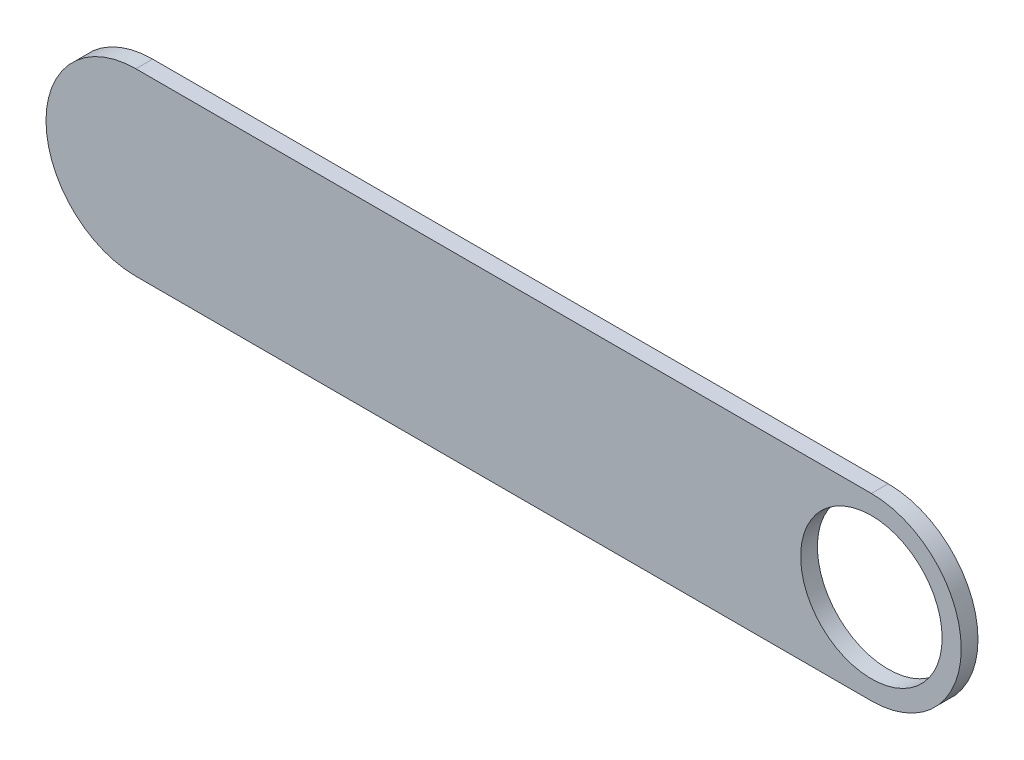
ISO-10303-21;
HEADER;
FILE_DESCRIPTION(('STEP AP214'),'2;1');
FILE_NAME('part.step','',(''),(''),'','','');
FILE_SCHEMA(('AUTOMOTIVE_DESIGN { 1 0 10303 214 1 1 1 1 }'));
ENDSEC;
DATA;
#1=APPLICATION_CONTEXT('core data for automotive mechanical design processes');
#2=APPLICATION_PROTOCOL_DEFINITION('international standard','automotive_design',2000,#1);
#3=PRODUCT_CONTEXT('',#1,'mechanical');
#4=PRODUCT('Part','Part','',(#3));
#5=PRODUCT_RELATED_PRODUCT_CATEGORY('part','',(#4));
#6=PRODUCT_DEFINITION_FORMATION('','',#4);
#7=PRODUCT_DEFINITION_CONTEXT('part definition',#1,'design');
#8=PRODUCT_DEFINITION('design','',#6,#7);
#9=PRODUCT_DEFINITION_SHAPE('','',#8);
#10=(LENGTH_UNIT() NAMED_UNIT(*) SI_UNIT(.MILLI.,.METRE.));
#11=(NAMED_UNIT(*) PLANE_ANGLE_UNIT() SI_UNIT($,.RADIAN.));
#12=(NAMED_UNIT(*) SI_UNIT($,.STERADIAN.) SOLID_ANGLE_UNIT());
#13=UNCERTAINTY_MEASURE_WITH_UNIT(LENGTH_MEASURE(1.E-05),#10,'distance_accuracy_value','');
#14=(GEOMETRIC_REPRESENTATION_CONTEXT(3) GLOBAL_UNCERTAINTY_ASSIGNED_CONTEXT((#13)) GLOBAL_UNIT_ASSIGNED_CONTEXT((#10,
#11,#12)) REPRESENTATION_CONTEXT('',''));
#15=CARTESIAN_POINT('',(0.,0.,0.));
#16=DIRECTION('',(0.,0.,1.));
#17=DIRECTION('',(1.,0.,0.));
#18=AXIS2_PLACEMENT_3D('',#15,#16,#17);
#19=CARTESIAN_POINT('',(19.64950096,12.2555,0.));
#20=DIRECTION('',(0.,1.,0.));
#21=DIRECTION('',(1.,0.,0.));
#22=AXIS2_PLACEMENT_3D('',#19,#20,#21);
#23=PLANE('',#22);
#24=DIRECTION('',(1.,0.,0.));
#25=VECTOR('',#24,1.);
#26=CARTESIAN_POINT('',(19.64950096,12.2555,0.03556));
#27=LINE('',#26,#25);
#28=CARTESIAN_POINT('',(19.64950096,12.2555,0.03556));
#29=VERTEX_POINT('',#28);
#30=CARTESIAN_POINT('',(21.209,12.2555,0.03556));
#31=VERTEX_POINT('',#30);
#32=EDGE_CURVE('E11',#29,#31,#27,.T.);
#33=ORIENTED_EDGE('',*,*,#32,.F.);
#34=DIRECTION('',(0.,0.,1.));
#35=VECTOR('',#34,1.);
#36=CARTESIAN_POINT('',(19.64950096,12.2555,0.));
#37=LINE('',#36,#35);
#38=CARTESIAN_POINT('',(19.64950096,12.2555,0.));
#39=VERTEX_POINT('',#38);
#40=EDGE_CURVE('E23',#39,#29,#37,.T.);
#41=ORIENTED_EDGE('',*,*,#40,.F.);
#42=DIRECTION('',(1.,0.,0.));
#43=VECTOR('',#42,1.);
#44=CARTESIAN_POINT('',(19.64950096,12.2555,0.));
#45=LINE('',#44,#43);
#46=CARTESIAN_POINT('',(21.209,12.2555,0.));
#47=VERTEX_POINT('',#46);
#48=EDGE_CURVE('E95',#39,#47,#45,.T.);
#49=ORIENTED_EDGE('',*,*,#48,.T.);
#50=DIRECTION('',(0.,0.,1.));
#51=VECTOR('',#50,1.);
#52=CARTESIAN_POINT('',(21.209,12.2555,0.));
#53=LINE('',#52,#51);
#54=EDGE_CURVE('E36',#47,#31,#53,.T.);
#55=ORIENTED_EDGE('',*,*,#54,.T.);
#56=EDGE_LOOP('',(#33,#41,#49,#55));
#57=FACE_BOUND('',#56,.T.);
#58=ADVANCED_FACE('F16',(#57),#23,.F.);
#59=CARTESIAN_POINT('',(19.64950096,12.446,0.));
#60=DIRECTION('',(0.,0.,-1.));
#61=DIRECTION('',(0.,1.,0.));
#62=AXIS2_PLACEMENT_3D('',#59,#60,#61);
#63=CYLINDRICAL_SURFACE('',#62,0.1905);
#64=CARTESIAN_POINT('',(19.64950096,12.446,0.03556));
#65=DIRECTION('',(0.,0.,1.));
#66=DIRECTION('',(0.,1.,0.));
#67=AXIS2_PLACEMENT_3D('',#64,#65,#66);
#68=CIRCLE('',#67,0.1905);
#69=CARTESIAN_POINT('',(19.64950096,12.6365,0.03556));
#70=VERTEX_POINT('',#69);
#71=EDGE_CURVE('E91',#70,#29,#68,.T.);
#72=ORIENTED_EDGE('',*,*,#71,.F.);
#73=DIRECTION('',(0.,0.,1.));
#74=VECTOR('',#73,1.);
#75=CARTESIAN_POINT('',(19.64950096,12.6365,0.));
#76=LINE('',#75,#74);
#77=CARTESIAN_POINT('',(19.64950096,12.6365,0.));
#78=VERTEX_POINT('',#77);
#79=EDGE_CURVE('E89',#78,#70,#76,.T.);
#80=ORIENTED_EDGE('',*,*,#79,.F.);
#81=CARTESIAN_POINT('',(19.64950096,12.446,0.));
#82=DIRECTION('',(0.,0.,1.));
#83=DIRECTION('',(0.,1.,0.));
#84=AXIS2_PLACEMENT_3D('',#81,#82,#83);
#85=CIRCLE('',#84,0.1905);
#86=EDGE_CURVE('E87',#78,#39,#85,.T.);
#87=ORIENTED_EDGE('',*,*,#86,.T.);
#88=ORIENTED_EDGE('',*,*,#40,.T.);
#89=EDGE_LOOP('',(#72,#80,#87,#88));
#90=FACE_BOUND('',#89,.T.);
#91=ADVANCED_FACE('F110',(#90),#63,.T.);
#92=CARTESIAN_POINT('',(21.209,12.446,0.));
#93=DIRECTION('',(0.,0.,-1.));
#94=DIRECTION('',(0.,-1.,0.));
#95=AXIS2_PLACEMENT_3D('',#92,#93,#94);
#96=CYLINDRICAL_SURFACE('',#95,0.1905);
#97=CARTESIAN_POINT('',(21.209,12.446,0.03556));
#98=DIRECTION('',(0.,0.,1.));
#99=DIRECTION('',(0.,-1.,0.));
#100=AXIS2_PLACEMENT_3D('',#97,#98,#99);
#101=CIRCLE('',#100,0.1905);
#102=CARTESIAN_POINT('',(21.209,12.6365,0.03556));
#103=VERTEX_POINT('',#102);
#104=EDGE_CURVE('E84',#31,#103,#101,.T.);
#105=ORIENTED_EDGE('',*,*,#104,.F.);
#106=ORIENTED_EDGE('',*,*,#54,.F.);
#107=CARTESIAN_POINT('',(21.209,12.446,0.));
#108=DIRECTION('',(0.,0.,1.));
#109=DIRECTION('',(0.,-1.,0.));
#110=AXIS2_PLACEMENT_3D('',#107,#108,#109);
#111=CIRCLE('',#110,0.1905);
#112=CARTESIAN_POINT('',(21.209,12.6365,0.));
#113=VERTEX_POINT('',#112);
#114=EDGE_CURVE('E81',#47,#113,#111,.T.);
#115=ORIENTED_EDGE('',*,*,#114,.T.);
#116=DIRECTION('',(0.,0.,1.));
#117=VECTOR('',#116,1.);
#118=CARTESIAN_POINT('',(21.209,12.6365,0.));
#119=LINE('',#118,#117);
#120=EDGE_CURVE('E79',#113,#103,#119,.T.);
#121=ORIENTED_EDGE('',*,*,#120,.T.);
#122=EDGE_LOOP('',(#105,#106,#115,#121));
#123=FACE_BOUND('',#122,.T.);
#124=ADVANCED_FACE('F103',(#123),#96,.T.);
#125=CARTESIAN_POINT('',(21.209,12.6365,0.));
#126=DIRECTION('',(0.,-1.,0.));
#127=DIRECTION('',(-1.,0.,0.));
#128=AXIS2_PLACEMENT_3D('',#125,#126,#127);
#129=PLANE('',#128);
#130=DIRECTION('',(-1.,0.,0.));
#131=VECTOR('',#130,1.);
#132=CARTESIAN_POINT('',(21.209,12.6365,0.03556));
#133=LINE('',#132,#131);
#134=EDGE_CURVE('E76',#103,#70,#133,.T.);
#135=ORIENTED_EDGE('',*,*,#134,.F.);
#136=ORIENTED_EDGE('',*,*,#120,.F.);
#137=DIRECTION('',(-1.,0.,0.));
#138=VECTOR('',#137,1.);
#139=CARTESIAN_POINT('',(21.209,12.6365,0.));
#140=LINE('',#139,#138);
#141=EDGE_CURVE('E67',#113,#78,#140,.T.);
#142=ORIENTED_EDGE('',*,*,#141,.T.);
#143=ORIENTED_EDGE('',*,*,#79,.T.);
#144=EDGE_LOOP('',(#135,#136,#142,#143));
#145=FACE_BOUND('',#144,.T.);
#146=ADVANCED_FACE('F109',(#145),#129,.F.);
#147=CARTESIAN_POINT('',(21.209,12.446,0.));
#148=DIRECTION('',(0.,0.,-1.));
#149=DIRECTION('',(1.,0.,0.));
#150=AXIS2_PLACEMENT_3D('',#147,#148,#149);
#151=CYLINDRICAL_SURFACE('',#150,0.1499997);
#152=DIRECTION('',(0.,0.,1.));
#153=VECTOR('',#152,1.);
#154=CARTESIAN_POINT('',(21.3589997,12.446,0.));
#155=LINE('',#154,#153);
#156=CARTESIAN_POINT('',(21.3589997,12.446,0.));
#157=VERTEX_POINT('',#156);
#158=CARTESIAN_POINT('',(21.3589997,12.446,0.03556));
#159=VERTEX_POINT('',#158);
#160=EDGE_CURVE('E61',#157,#159,#155,.T.);
#161=ORIENTED_EDGE('',*,*,#160,.T.);
#162=CARTESIAN_POINT('',(21.209,12.446,0.03556));
#163=DIRECTION('',(0.,0.,1.));
#164=DIRECTION('',(1.,0.,0.));
#165=AXIS2_PLACEMENT_3D('',#162,#163,#164);
#166=CIRCLE('',#165,0.1499997);
#167=EDGE_CURVE('E66',#159,#159,#166,.T.);
#168=ORIENTED_EDGE('',*,*,#167,.T.);
#169=ORIENTED_EDGE('',*,*,#160,.F.);
#170=CARTESIAN_POINT('',(21.209,12.446,0.));
#171=DIRECTION('',(0.,0.,1.));
#172=DIRECTION('',(1.,0.,0.));
#173=AXIS2_PLACEMENT_3D('',#170,#171,#172);
#174=CIRCLE('',#173,0.1499997);
#175=EDGE_CURVE('E64',#157,#157,#174,.T.);
#176=ORIENTED_EDGE('',*,*,#175,.F.);
#177=EDGE_LOOP('',(#161,#168,#169,#176));
#178=FACE_BOUND('',#177,.T.);
#179=ADVANCED_FACE('F63',(#178),#151,.F.);
#180=CARTESIAN_POINT('',(20.42925048,12.446,0.));
#181=DIRECTION('',(0.,0.,1.));
#182=DIRECTION('',(1.,0.,0.));
#183=AXIS2_PLACEMENT_3D('',#180,#181,#182);
#184=PLANE('',#183);
#185=ORIENTED_EDGE('',*,*,#141,.F.);
#186=ORIENTED_EDGE('',*,*,#114,.F.);
#187=ORIENTED_EDGE('',*,*,#48,.F.);
#188=ORIENTED_EDGE('',*,*,#86,.F.);
#189=EDGE_LOOP('',(#185,#186,#187,#188));
#190=FACE_BOUND('',#189,.T.);
#191=ORIENTED_EDGE('',*,*,#175,.T.);
#192=EDGE_LOOP('',(#191));
#193=FACE_BOUND('',#192,.T.);
#194=ADVANCED_FACE('F70',(#190,#193),#184,.F.);
#195=CARTESIAN_POINT('',(20.42925048,12.446,0.03556));
#196=DIRECTION('',(0.,0.,1.));
#197=DIRECTION('',(1.,0.,0.));
#198=AXIS2_PLACEMENT_3D('',#195,#196,#197);
#199=PLANE('',#198);
#200=ORIENTED_EDGE('',*,*,#32,.T.);
#201=ORIENTED_EDGE('',*,*,#104,.T.);
#202=ORIENTED_EDGE('',*,*,#134,.T.);
#203=ORIENTED_EDGE('',*,*,#71,.T.);
#204=EDGE_LOOP('',(#200,#201,#202,#203));
#205=FACE_BOUND('',#204,.T.);
#206=ORIENTED_EDGE('',*,*,#167,.F.);
#207=EDGE_LOOP('',(#206));
#208=FACE_BOUND('',#207,.T.);
#209=ADVANCED_FACE('F106',(#205,#208),#199,.T.);
#210=CLOSED_SHELL('',(#58,#91,#124,#146,#179,#194,#209));
#211=MANIFOLD_SOLID_BREP('B1',#210);
#212=ADVANCED_BREP_SHAPE_REPRESENTATION('',(#18,#211),#14);
#213=SHAPE_DEFINITION_REPRESENTATION(#9,#212);
ENDSEC;
END-ISO-10303-21;
